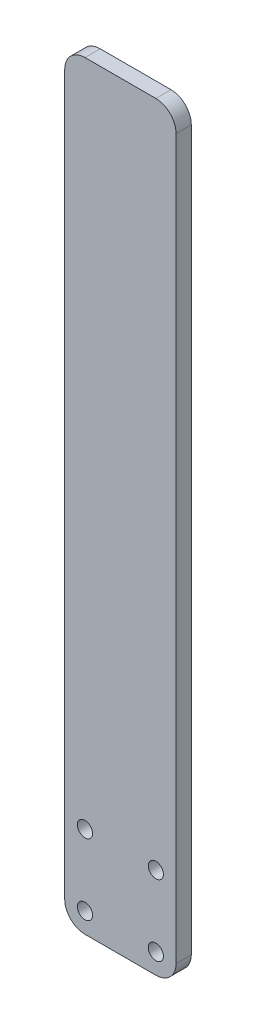
ISO-10303-21;
HEADER;
FILE_DESCRIPTION(('STEP AP214'),'2;1');
FILE_NAME('part.step','',(''),(''),'','','');
FILE_SCHEMA(('AUTOMOTIVE_DESIGN { 1 0 10303 214 1 1 1 1 }'));
ENDSEC;
DATA;
#1=APPLICATION_CONTEXT('core data for automotive mechanical design processes');
#2=APPLICATION_PROTOCOL_DEFINITION('international standard','automotive_design',2000,#1);
#3=PRODUCT_CONTEXT('',#1,'mechanical');
#4=PRODUCT('Part','Part','',(#3));
#5=PRODUCT_RELATED_PRODUCT_CATEGORY('part','',(#4));
#6=PRODUCT_DEFINITION_FORMATION('','',#4);
#7=PRODUCT_DEFINITION_CONTEXT('part definition',#1,'design');
#8=PRODUCT_DEFINITION('design','',#6,#7);
#9=PRODUCT_DEFINITION_SHAPE('','',#8);
#10=(LENGTH_UNIT() NAMED_UNIT(*) SI_UNIT(.MILLI.,.METRE.));
#11=(NAMED_UNIT(*) PLANE_ANGLE_UNIT() SI_UNIT($,.RADIAN.));
#12=(NAMED_UNIT(*) SI_UNIT($,.STERADIAN.) SOLID_ANGLE_UNIT());
#13=UNCERTAINTY_MEASURE_WITH_UNIT(LENGTH_MEASURE(1.E-05),#10,'distance_accuracy_value','');
#14=(GEOMETRIC_REPRESENTATION_CONTEXT(3) GLOBAL_UNCERTAINTY_ASSIGNED_CONTEXT((#13)) GLOBAL_UNIT_ASSIGNED_CONTEXT((#10,
#11,#12)) REPRESENTATION_CONTEXT('',''));
#15=CARTESIAN_POINT('',(0.,0.,0.));
#16=DIRECTION('',(0.,0.,1.));
#17=DIRECTION('',(1.,0.,0.));
#18=AXIS2_PLACEMENT_3D('',#15,#16,#17);
#19=CARTESIAN_POINT('',(0.,0.,3.));
#20=DIRECTION('',(0.,0.,1.));
#21=DIRECTION('',(1.,0.,0.));
#22=AXIS2_PLACEMENT_3D('',#19,#20,#21);
#23=PLANE('',#22);
#24=CARTESIAN_POINT('',(7.,18.,3.));
#25=DIRECTION('',(0.,0.,1.));
#26=DIRECTION('',(-1.,0.,0.));
#27=AXIS2_PLACEMENT_3D('',#24,#25,#26);
#28=CIRCLE('',#27,1.5);
#29=CARTESIAN_POINT('',(5.5,18.,3.));
#30=VERTEX_POINT('',#29);
#31=EDGE_CURVE('E183',#30,#30,#28,.T.);
#32=ORIENTED_EDGE('',*,*,#31,.F.);
#33=EDGE_LOOP('',(#32));
#34=FACE_BOUND('',#33,.T.);
#35=CARTESIAN_POINT('',(7.,4.,3.));
#36=DIRECTION('',(0.,0.,1.));
#37=DIRECTION('',(1.,0.,0.));
#38=AXIS2_PLACEMENT_3D('',#35,#36,#37);
#39=CIRCLE('',#38,1.5);
#40=CARTESIAN_POINT('',(8.5,4.,3.));
#41=VERTEX_POINT('',#40);
#42=EDGE_CURVE('E166',#41,#41,#39,.T.);
#43=ORIENTED_EDGE('',*,*,#42,.F.);
#44=EDGE_LOOP('',(#43));
#45=FACE_BOUND('',#44,.T.);
#46=DIRECTION('',(0.,1.,0.));
#47=VECTOR('',#46,1.);
#48=CARTESIAN_POINT('',(11.,150.,3.));
#49=LINE('',#48,#47);
#50=CARTESIAN_POINT('',(11.,4.,3.));
#51=VERTEX_POINT('',#50);
#52=CARTESIAN_POINT('',(11.,146.,3.));
#53=VERTEX_POINT('',#52);
#54=EDGE_CURVE('E173',#51,#53,#49,.T.);
#55=ORIENTED_EDGE('',*,*,#54,.T.);
#56=CARTESIAN_POINT('',(6.99999999999999,146.,3.));
#57=DIRECTION('',(0.,0.,1.));
#58=DIRECTION('',(1.,0.,0.));
#59=AXIS2_PLACEMENT_3D('',#56,#57,#58);
#60=CIRCLE('',#59,4.);
#61=CARTESIAN_POINT('',(6.99999999999999,150.,3.));
#62=VERTEX_POINT('',#61);
#63=EDGE_CURVE('E150',#53,#62,#60,.T.);
#64=ORIENTED_EDGE('',*,*,#63,.T.);
#65=DIRECTION('',(-1.,0.,0.));
#66=VECTOR('',#65,1.);
#67=CARTESIAN_POINT('',(-11.,150.,3.));
#68=LINE('',#67,#66);
#69=CARTESIAN_POINT('',(-7.00000000000001,150.,3.));
#70=VERTEX_POINT('',#69);
#71=EDGE_CURVE('E121',#62,#70,#68,.T.);
#72=ORIENTED_EDGE('',*,*,#71,.T.);
#73=CARTESIAN_POINT('',(-7.00000000000001,146.,3.));
#74=DIRECTION('',(0.,0.,1.));
#75=DIRECTION('',(1.,0.,0.));
#76=AXIS2_PLACEMENT_3D('',#73,#74,#75);
#77=CIRCLE('',#76,4.);
#78=CARTESIAN_POINT('',(-11.,146.,3.));
#79=VERTEX_POINT('',#78);
#80=EDGE_CURVE('E148',#70,#79,#77,.T.);
#81=ORIENTED_EDGE('',*,*,#80,.T.);
#82=DIRECTION('',(0.,-1.,0.));
#83=VECTOR('',#82,1.);
#84=CARTESIAN_POINT('',(-11.,150.,3.));
#85=LINE('',#84,#83);
#86=CARTESIAN_POINT('',(-11.,4.,3.));
#87=VERTEX_POINT('',#86);
#88=EDGE_CURVE('E128',#79,#87,#85,.T.);
#89=ORIENTED_EDGE('',*,*,#88,.T.);
#90=CARTESIAN_POINT('',(-7.,4.,3.));
#91=DIRECTION('',(0.,0.,1.));
#92=DIRECTION('',(1.,0.,0.));
#93=AXIS2_PLACEMENT_3D('',#90,#91,#92);
#94=CIRCLE('',#93,4.);
#95=CARTESIAN_POINT('',(-6.99999999999999,0.,3.));
#96=VERTEX_POINT('',#95);
#97=EDGE_CURVE('E56',#87,#96,#94,.T.);
#98=ORIENTED_EDGE('',*,*,#97,.T.);
#99=DIRECTION('',(1.,0.,0.));
#100=VECTOR('',#99,1.);
#101=CARTESIAN_POINT('',(-11.,0.,3.));
#102=LINE('',#101,#100);
#103=CARTESIAN_POINT('',(7.,0.,3.));
#104=VERTEX_POINT('',#103);
#105=EDGE_CURVE('E131',#96,#104,#102,.T.);
#106=ORIENTED_EDGE('',*,*,#105,.T.);
#107=CARTESIAN_POINT('',(7.,4.,3.));
#108=DIRECTION('',(0.,0.,1.));
#109=DIRECTION('',(1.,0.,0.));
#110=AXIS2_PLACEMENT_3D('',#107,#108,#109);
#111=CIRCLE('',#110,4.);
#112=EDGE_CURVE('E145',#104,#51,#111,.T.);
#113=ORIENTED_EDGE('',*,*,#112,.T.);
#114=EDGE_LOOP('',(#55,#64,#72,#81,#89,#98,#106,#113));
#115=FACE_BOUND('',#114,.T.);
#116=CARTESIAN_POINT('',(-7.,4.,3.));
#117=DIRECTION('',(0.,0.,1.));
#118=DIRECTION('',(-1.,0.,0.));
#119=AXIS2_PLACEMENT_3D('',#116,#117,#118);
#120=CIRCLE('',#119,1.5);
#121=CARTESIAN_POINT('',(-8.5,4.,3.));
#122=VERTEX_POINT('',#121);
#123=EDGE_CURVE('E178',#122,#122,#120,.T.);
#124=ORIENTED_EDGE('',*,*,#123,.F.);
#125=EDGE_LOOP('',(#124));
#126=FACE_BOUND('',#125,.T.);
#127=CARTESIAN_POINT('',(-7.,18.,3.));
#128=DIRECTION('',(0.,0.,1.));
#129=DIRECTION('',(1.,0.,0.));
#130=AXIS2_PLACEMENT_3D('',#127,#128,#129);
#131=CIRCLE('',#130,1.5);
#132=CARTESIAN_POINT('',(-5.49999999999999,18.,3.));
#133=VERTEX_POINT('',#132);
#134=EDGE_CURVE('E189',#133,#133,#131,.T.);
#135=ORIENTED_EDGE('',*,*,#134,.F.);
#136=EDGE_LOOP('',(#135));
#137=FACE_BOUND('',#136,.T.);
#138=ADVANCED_FACE('F35',(#34,#45,#115,#126,#137),#23,.T.);
#139=CARTESIAN_POINT('',(0.,0.,0.));
#140=DIRECTION('',(0.,0.,1.));
#141=DIRECTION('',(1.,0.,0.));
#142=AXIS2_PLACEMENT_3D('',#139,#140,#141);
#143=PLANE('',#142);
#144=CARTESIAN_POINT('',(7.,18.,0.));
#145=DIRECTION('',(0.,0.,1.));
#146=DIRECTION('',(-1.,0.,0.));
#147=AXIS2_PLACEMENT_3D('',#144,#145,#146);
#148=CIRCLE('',#147,1.5);
#149=CARTESIAN_POINT('',(5.5,18.,0.));
#150=VERTEX_POINT('',#149);
#151=EDGE_CURVE('E186',#150,#150,#148,.T.);
#152=ORIENTED_EDGE('',*,*,#151,.T.);
#153=EDGE_LOOP('',(#152));
#154=FACE_BOUND('',#153,.T.);
#155=CARTESIAN_POINT('',(7.,4.,0.));
#156=DIRECTION('',(0.,0.,1.));
#157=DIRECTION('',(1.,0.,0.));
#158=AXIS2_PLACEMENT_3D('',#155,#156,#157);
#159=CIRCLE('',#158,1.5);
#160=CARTESIAN_POINT('',(8.5,4.,0.));
#161=VERTEX_POINT('',#160);
#162=EDGE_CURVE('E169',#161,#161,#159,.T.);
#163=ORIENTED_EDGE('',*,*,#162,.T.);
#164=EDGE_LOOP('',(#163));
#165=FACE_BOUND('',#164,.T.);
#166=DIRECTION('',(-1.,0.,0.));
#167=VECTOR('',#166,1.);
#168=CARTESIAN_POINT('',(-11.,150.,0.));
#169=LINE('',#168,#167);
#170=CARTESIAN_POINT('',(6.99999999999999,150.,0.));
#171=VERTEX_POINT('',#170);
#172=CARTESIAN_POINT('',(-7.00000000000001,150.,0.));
#173=VERTEX_POINT('',#172);
#174=EDGE_CURVE('E118',#171,#173,#169,.T.);
#175=ORIENTED_EDGE('',*,*,#174,.F.);
#176=CARTESIAN_POINT('',(6.99999999999999,146.,0.));
#177=DIRECTION('',(0.,0.,1.));
#178=DIRECTION('',(1.,0.,0.));
#179=AXIS2_PLACEMENT_3D('',#176,#177,#178);
#180=CIRCLE('',#179,4.);
#181=CARTESIAN_POINT('',(11.,146.,0.));
#182=VERTEX_POINT('',#181);
#183=EDGE_CURVE('E101',#171,#182,#180,.F.);
#184=ORIENTED_EDGE('',*,*,#183,.T.);
#185=DIRECTION('',(0.,1.,0.));
#186=VECTOR('',#185,1.);
#187=CARTESIAN_POINT('',(11.,150.,0.));
#188=LINE('',#187,#186);
#189=CARTESIAN_POINT('',(11.,4.,0.));
#190=VERTEX_POINT('',#189);
#191=EDGE_CURVE('E129',#190,#182,#188,.T.);
#192=ORIENTED_EDGE('',*,*,#191,.F.);
#193=CARTESIAN_POINT('',(7.,4.,0.));
#194=DIRECTION('',(0.,0.,1.));
#195=DIRECTION('',(1.,0.,0.));
#196=AXIS2_PLACEMENT_3D('',#193,#194,#195);
#197=CIRCLE('',#196,4.);
#198=CARTESIAN_POINT('',(7.,0.,0.));
#199=VERTEX_POINT('',#198);
#200=EDGE_CURVE('E122',#190,#199,#197,.F.);
#201=ORIENTED_EDGE('',*,*,#200,.T.);
#202=DIRECTION('',(1.,0.,0.));
#203=VECTOR('',#202,1.);
#204=CARTESIAN_POINT('',(-11.,0.,0.));
#205=LINE('',#204,#203);
#206=CARTESIAN_POINT('',(-6.99999999999999,0.,0.));
#207=VERTEX_POINT('',#206);
#208=EDGE_CURVE('E133',#207,#199,#205,.T.);
#209=ORIENTED_EDGE('',*,*,#208,.F.);
#210=CARTESIAN_POINT('',(-7.,4.,0.));
#211=DIRECTION('',(0.,0.,1.));
#212=DIRECTION('',(1.,0.,0.));
#213=AXIS2_PLACEMENT_3D('',#210,#211,#212);
#214=CIRCLE('',#213,4.);
#215=CARTESIAN_POINT('',(-11.,4.,0.));
#216=VERTEX_POINT('',#215);
#217=EDGE_CURVE('E139',#207,#216,#214,.F.);
#218=ORIENTED_EDGE('',*,*,#217,.T.);
#219=DIRECTION('',(0.,-1.,0.));
#220=VECTOR('',#219,1.);
#221=CARTESIAN_POINT('',(-11.,150.,0.));
#222=LINE('',#221,#220);
#223=CARTESIAN_POINT('',(-11.,146.,0.));
#224=VERTEX_POINT('',#223);
#225=EDGE_CURVE('E161',#224,#216,#222,.T.);
#226=ORIENTED_EDGE('',*,*,#225,.F.);
#227=CARTESIAN_POINT('',(-7.00000000000001,146.,0.));
#228=DIRECTION('',(0.,0.,1.));
#229=DIRECTION('',(1.,0.,0.));
#230=AXIS2_PLACEMENT_3D('',#227,#228,#229);
#231=CIRCLE('',#230,4.);
#232=EDGE_CURVE('E112',#224,#173,#231,.F.);
#233=ORIENTED_EDGE('',*,*,#232,.T.);
#234=EDGE_LOOP('',(#175,#184,#192,#201,#209,#218,#226,#233));
#235=FACE_BOUND('',#234,.T.);
#236=CARTESIAN_POINT('',(-7.,4.,0.));
#237=DIRECTION('',(0.,0.,1.));
#238=DIRECTION('',(-1.,0.,0.));
#239=AXIS2_PLACEMENT_3D('',#236,#237,#238);
#240=CIRCLE('',#239,1.5);
#241=CARTESIAN_POINT('',(-8.5,4.,0.));
#242=VERTEX_POINT('',#241);
#243=EDGE_CURVE('E180',#242,#242,#240,.T.);
#244=ORIENTED_EDGE('',*,*,#243,.T.);
#245=EDGE_LOOP('',(#244));
#246=FACE_BOUND('',#245,.T.);
#247=CARTESIAN_POINT('',(-7.,18.,0.));
#248=DIRECTION('',(0.,0.,1.));
#249=DIRECTION('',(1.,0.,0.));
#250=AXIS2_PLACEMENT_3D('',#247,#248,#249);
#251=CIRCLE('',#250,1.5);
#252=CARTESIAN_POINT('',(-5.49999999999999,18.,0.));
#253=VERTEX_POINT('',#252);
#254=EDGE_CURVE('E192',#253,#253,#251,.T.);
#255=ORIENTED_EDGE('',*,*,#254,.T.);
#256=EDGE_LOOP('',(#255));
#257=FACE_BOUND('',#256,.T.);
#258=ADVANCED_FACE('F125',(#154,#165,#235,#246,#257),#143,.F.);
#259=CARTESIAN_POINT('',(-11.,150.,3.));
#260=DIRECTION('',(1.,0.,0.));
#261=DIRECTION('',(0.,1.,0.));
#262=AXIS2_PLACEMENT_3D('',#259,#260,#261);
#263=PLANE('',#262);
#264=ORIENTED_EDGE('',*,*,#88,.F.);
#265=DIRECTION('',(0.,0.,-1.));
#266=VECTOR('',#265,1.);
#267=CARTESIAN_POINT('',(-11.,146.,3.));
#268=LINE('',#267,#266);
#269=EDGE_CURVE('E154',#79,#224,#268,.T.);
#270=ORIENTED_EDGE('',*,*,#269,.T.);
#271=ORIENTED_EDGE('',*,*,#225,.T.);
#272=DIRECTION('',(0.,0.,-1.));
#273=VECTOR('',#272,1.);
#274=CARTESIAN_POINT('',(-11.,4.,3.));
#275=LINE('',#274,#273);
#276=EDGE_CURVE('E152',#216,#87,#275,.F.);
#277=ORIENTED_EDGE('',*,*,#276,.T.);
#278=EDGE_LOOP('',(#264,#270,#271,#277));
#279=FACE_BOUND('',#278,.T.);
#280=ADVANCED_FACE('F160',(#279),#263,.F.);
#281=CARTESIAN_POINT('',(-11.,0.,3.));
#282=DIRECTION('',(0.,1.,0.));
#283=DIRECTION('',(-1.,0.,0.));
#284=AXIS2_PLACEMENT_3D('',#281,#282,#283);
#285=PLANE('',#284);
#286=ORIENTED_EDGE('',*,*,#105,.F.);
#287=DIRECTION('',(0.,0.,-1.));
#288=VECTOR('',#287,1.);
#289=CARTESIAN_POINT('',(-6.99999999999999,0.,3.));
#290=LINE('',#289,#288);
#291=EDGE_CURVE('E11',#96,#207,#290,.T.);
#292=ORIENTED_EDGE('',*,*,#291,.T.);
#293=ORIENTED_EDGE('',*,*,#208,.T.);
#294=DIRECTION('',(0.,0.,-1.));
#295=VECTOR('',#294,1.);
#296=CARTESIAN_POINT('',(7.,0.,3.));
#297=LINE('',#296,#295);
#298=EDGE_CURVE('E43',#199,#104,#297,.F.);
#299=ORIENTED_EDGE('',*,*,#298,.T.);
#300=EDGE_LOOP('',(#286,#292,#293,#299));
#301=FACE_BOUND('',#300,.T.);
#302=ADVANCED_FACE('F220',(#301),#285,.F.);
#303=CARTESIAN_POINT('',(11.,150.,3.));
#304=DIRECTION('',(-1.,0.,0.));
#305=DIRECTION('',(0.,-1.,0.));
#306=AXIS2_PLACEMENT_3D('',#303,#304,#305);
#307=PLANE('',#306);
#308=ORIENTED_EDGE('',*,*,#191,.T.);
#309=DIRECTION('',(0.,0.,-1.));
#310=VECTOR('',#309,1.);
#311=CARTESIAN_POINT('',(11.,146.,3.));
#312=LINE('',#311,#310);
#313=EDGE_CURVE('E106',#182,#53,#312,.F.);
#314=ORIENTED_EDGE('',*,*,#313,.T.);
#315=ORIENTED_EDGE('',*,*,#54,.F.);
#316=DIRECTION('',(0.,0.,-1.));
#317=VECTOR('',#316,1.);
#318=CARTESIAN_POINT('',(11.,4.,3.));
#319=LINE('',#318,#317);
#320=EDGE_CURVE('E111',#51,#190,#319,.T.);
#321=ORIENTED_EDGE('',*,*,#320,.T.);
#322=EDGE_LOOP('',(#308,#314,#315,#321));
#323=FACE_BOUND('',#322,.T.);
#324=ADVANCED_FACE('F217',(#323),#307,.F.);
#325=CARTESIAN_POINT('',(-11.,150.,3.));
#326=DIRECTION('',(0.,-1.,0.));
#327=DIRECTION('',(0.,0.,-1.));
#328=AXIS2_PLACEMENT_3D('',#325,#326,#327);
#329=PLANE('',#328);
#330=ORIENTED_EDGE('',*,*,#71,.F.);
#331=DIRECTION('',(0.,0.,-1.));
#332=VECTOR('',#331,1.);
#333=CARTESIAN_POINT('',(6.99999999999999,150.,3.));
#334=LINE('',#333,#332);
#335=EDGE_CURVE('E105',#62,#171,#334,.T.);
#336=ORIENTED_EDGE('',*,*,#335,.T.);
#337=ORIENTED_EDGE('',*,*,#174,.T.);
#338=DIRECTION('',(0.,0.,-1.));
#339=VECTOR('',#338,1.);
#340=CARTESIAN_POINT('',(-7.00000000000001,150.,3.));
#341=LINE('',#340,#339);
#342=EDGE_CURVE('E123',#173,#70,#341,.F.);
#343=ORIENTED_EDGE('',*,*,#342,.T.);
#344=EDGE_LOOP('',(#330,#336,#337,#343));
#345=FACE_BOUND('',#344,.T.);
#346=ADVANCED_FACE('F117',(#345),#329,.F.);
#347=CARTESIAN_POINT('',(7.,4.,3.));
#348=DIRECTION('',(0.,0.,-1.));
#349=DIRECTION('',(-1.,0.,0.));
#350=AXIS2_PLACEMENT_3D('',#347,#348,#349);
#351=CYLINDRICAL_SURFACE('',#350,1.5);
#352=ORIENTED_EDGE('',*,*,#42,.T.);
#353=EDGE_LOOP('',(#352));
#354=FACE_BOUND('',#353,.T.);
#355=ORIENTED_EDGE('',*,*,#162,.F.);
#356=EDGE_LOOP('',(#355));
#357=FACE_BOUND('',#356,.T.);
#358=ADVANCED_FACE('F212',(#354,#357),#351,.F.);
#359=CARTESIAN_POINT('',(-7.,4.,3.));
#360=DIRECTION('',(0.,0.,-1.));
#361=DIRECTION('',(-1.,0.,0.));
#362=AXIS2_PLACEMENT_3D('',#359,#360,#361);
#363=CYLINDRICAL_SURFACE('',#362,1.5);
#364=ORIENTED_EDGE('',*,*,#123,.T.);
#365=EDGE_LOOP('',(#364));
#366=FACE_BOUND('',#365,.T.);
#367=ORIENTED_EDGE('',*,*,#243,.F.);
#368=EDGE_LOOP('',(#367));
#369=FACE_BOUND('',#368,.T.);
#370=ADVANCED_FACE('F244',(#366,#369),#363,.F.);
#371=CARTESIAN_POINT('',(7.,18.,3.));
#372=DIRECTION('',(0.,0.,-1.));
#373=DIRECTION('',(-1.,0.,0.));
#374=AXIS2_PLACEMENT_3D('',#371,#372,#373);
#375=CYLINDRICAL_SURFACE('',#374,1.5);
#376=ORIENTED_EDGE('',*,*,#31,.T.);
#377=EDGE_LOOP('',(#376));
#378=FACE_BOUND('',#377,.T.);
#379=ORIENTED_EDGE('',*,*,#151,.F.);
#380=EDGE_LOOP('',(#379));
#381=FACE_BOUND('',#380,.T.);
#382=ADVANCED_FACE('F247',(#378,#381),#375,.F.);
#383=CARTESIAN_POINT('',(-7.,18.,3.));
#384=DIRECTION('',(0.,0.,-1.));
#385=DIRECTION('',(-1.,0.,0.));
#386=AXIS2_PLACEMENT_3D('',#383,#384,#385);
#387=CYLINDRICAL_SURFACE('',#386,1.5);
#388=ORIENTED_EDGE('',*,*,#134,.T.);
#389=EDGE_LOOP('',(#388));
#390=FACE_BOUND('',#389,.T.);
#391=ORIENTED_EDGE('',*,*,#254,.F.);
#392=EDGE_LOOP('',(#391));
#393=FACE_BOUND('',#392,.T.);
#394=ADVANCED_FACE('F198',(#390,#393),#387,.F.);
#395=CARTESIAN_POINT('',(6.99999999999999,146.,3.));
#396=DIRECTION('',(0.,0.,-1.));
#397=DIRECTION('',(-1.,0.,0.));
#398=AXIS2_PLACEMENT_3D('',#395,#396,#397);
#399=CYLINDRICAL_SURFACE('',#398,4.);
#400=ORIENTED_EDGE('',*,*,#63,.F.);
#401=ORIENTED_EDGE('',*,*,#313,.F.);
#402=ORIENTED_EDGE('',*,*,#183,.F.);
#403=ORIENTED_EDGE('',*,*,#335,.F.);
#404=EDGE_LOOP('',(#400,#401,#402,#403));
#405=FACE_BOUND('',#404,.T.);
#406=ADVANCED_FACE('F104',(#405),#399,.T.);
#407=CARTESIAN_POINT('',(-7.00000000000001,146.,3.));
#408=DIRECTION('',(0.,0.,-1.));
#409=DIRECTION('',(-1.,0.,0.));
#410=AXIS2_PLACEMENT_3D('',#407,#408,#409);
#411=CYLINDRICAL_SURFACE('',#410,4.);
#412=ORIENTED_EDGE('',*,*,#80,.F.);
#413=ORIENTED_EDGE('',*,*,#342,.F.);
#414=ORIENTED_EDGE('',*,*,#232,.F.);
#415=ORIENTED_EDGE('',*,*,#269,.F.);
#416=EDGE_LOOP('',(#412,#413,#414,#415));
#417=FACE_BOUND('',#416,.T.);
#418=ADVANCED_FACE('F228',(#417),#411,.T.);
#419=CARTESIAN_POINT('',(-7.,4.,3.));
#420=DIRECTION('',(0.,0.,-1.));
#421=DIRECTION('',(-1.,0.,0.));
#422=AXIS2_PLACEMENT_3D('',#419,#420,#421);
#423=CYLINDRICAL_SURFACE('',#422,4.);
#424=ORIENTED_EDGE('',*,*,#97,.F.);
#425=ORIENTED_EDGE('',*,*,#276,.F.);
#426=ORIENTED_EDGE('',*,*,#217,.F.);
#427=ORIENTED_EDGE('',*,*,#291,.F.);
#428=EDGE_LOOP('',(#424,#425,#426,#427));
#429=FACE_BOUND('',#428,.T.);
#430=ADVANCED_FACE('F230',(#429),#423,.T.);
#431=CARTESIAN_POINT('',(7.,4.,3.));
#432=DIRECTION('',(0.,0.,-1.));
#433=DIRECTION('',(-1.,0.,0.));
#434=AXIS2_PLACEMENT_3D('',#431,#432,#433);
#435=CYLINDRICAL_SURFACE('',#434,4.);
#436=ORIENTED_EDGE('',*,*,#112,.F.);
#437=ORIENTED_EDGE('',*,*,#298,.F.);
#438=ORIENTED_EDGE('',*,*,#200,.F.);
#439=ORIENTED_EDGE('',*,*,#320,.F.);
#440=EDGE_LOOP('',(#436,#437,#438,#439));
#441=FACE_BOUND('',#440,.T.);
#442=ADVANCED_FACE('F37',(#441),#435,.T.);
#443=CLOSED_SHELL('',(#138,#258,#280,#302,#324,#346,#358,#370,#382,#394,#406,#418,#430,#442));
#444=MANIFOLD_SOLID_BREP('B2',#443);
#445=ADVANCED_BREP_SHAPE_REPRESENTATION('',(#18,#444),#14);
#446=SHAPE_DEFINITION_REPRESENTATION(#9,#445);
ENDSEC;
END-ISO-10303-21;
